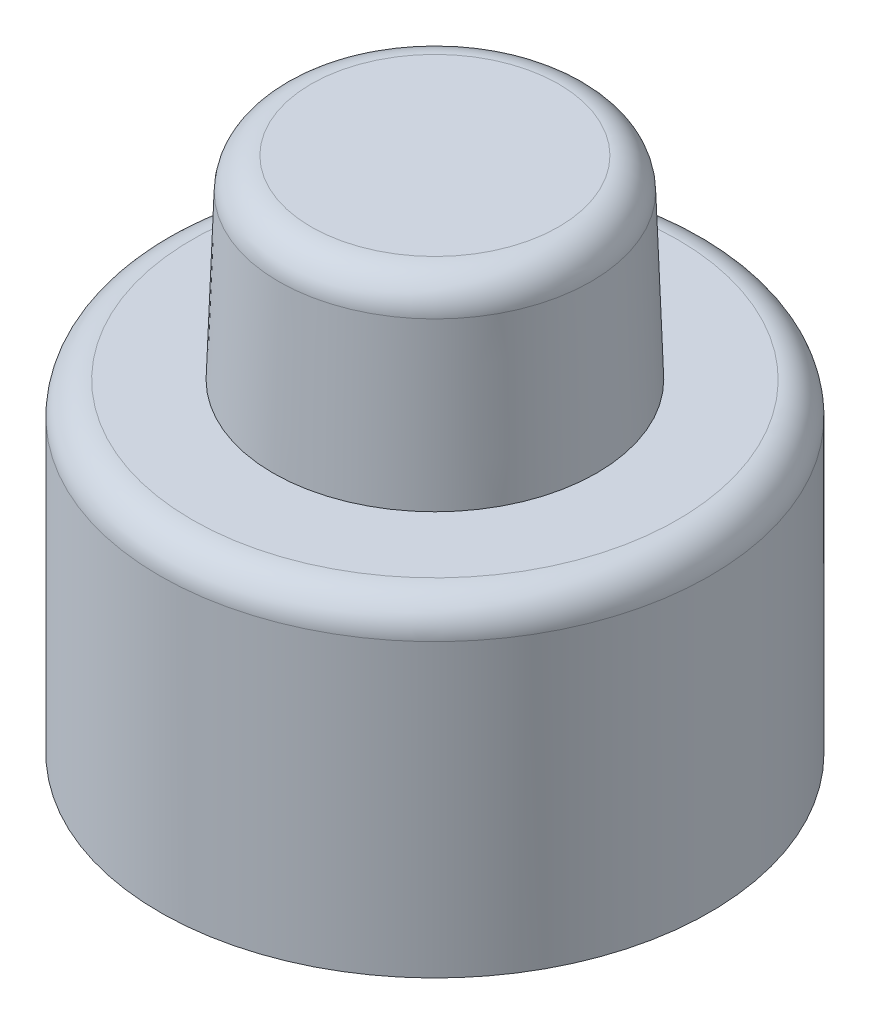
ISO-10303-21;
HEADER;
FILE_DESCRIPTION(('STEP AP214'),'2;1');
FILE_NAME('part.step','',(''),(''),'','','');
FILE_SCHEMA(('AUTOMOTIVE_DESIGN { 1 0 10303 214 1 1 1 1 }'));
ENDSEC;
DATA;
#1=APPLICATION_CONTEXT('core data for automotive mechanical design processes');
#2=APPLICATION_PROTOCOL_DEFINITION('international standard','automotive_design',2000,#1);
#3=PRODUCT_CONTEXT('',#1,'mechanical');
#4=PRODUCT('Part','Part','',(#3));
#5=PRODUCT_RELATED_PRODUCT_CATEGORY('part','',(#4));
#6=PRODUCT_DEFINITION_FORMATION('','',#4);
#7=PRODUCT_DEFINITION_CONTEXT('part definition',#1,'design');
#8=PRODUCT_DEFINITION('design','',#6,#7);
#9=PRODUCT_DEFINITION_SHAPE('','',#8);
#10=(LENGTH_UNIT() NAMED_UNIT(*) SI_UNIT(.MILLI.,.METRE.));
#11=(NAMED_UNIT(*) PLANE_ANGLE_UNIT() SI_UNIT($,.RADIAN.));
#12=(NAMED_UNIT(*) SI_UNIT($,.STERADIAN.) SOLID_ANGLE_UNIT());
#13=UNCERTAINTY_MEASURE_WITH_UNIT(LENGTH_MEASURE(1.E-05),#10,'distance_accuracy_value','');
#14=(GEOMETRIC_REPRESENTATION_CONTEXT(3) GLOBAL_UNCERTAINTY_ASSIGNED_CONTEXT((#13)) GLOBAL_UNIT_ASSIGNED_CONTEXT((#10,
#11,#12)) REPRESENTATION_CONTEXT('',''));
#15=CARTESIAN_POINT('',(0.,0.,0.));
#16=DIRECTION('',(0.,0.,1.));
#17=DIRECTION('',(1.,0.,0.));
#18=AXIS2_PLACEMENT_3D('',#15,#16,#17);
#19=CARTESIAN_POINT('',(-51.1201704164734,6.,0.));
#20=DIRECTION('',(0.,-1.,0.));
#21=DIRECTION('',(0.,0.,-1.));
#22=AXIS2_PLACEMENT_3D('',#19,#20,#21);
#23=CYLINDRICAL_SURFACE('',#22,8.5);
#24=CARTESIAN_POINT('',(-51.1201704164734,5.,0.));
#25=DIRECTION('',(0.,1.,0.));
#26=DIRECTION('',(0.,0.,1.));
#27=AXIS2_PLACEMENT_3D('',#24,#25,#26);
#28=CIRCLE('',#27,8.5);
#29=CARTESIAN_POINT('',(-51.1201704164734,5.,8.5));
#30=VERTEX_POINT('',#29);
#31=EDGE_CURVE('E138',#30,#30,#28,.F.);
#32=ORIENTED_EDGE('',*,*,#31,.T.);
#33=EDGE_LOOP('',(#32));
#34=FACE_BOUND('',#33,.T.);
#35=CARTESIAN_POINT('',(-51.1201704164734,3.,0.));
#36=DIRECTION('',(0.,-1.,0.));
#37=DIRECTION('',(0.,0.,-1.));
#38=AXIS2_PLACEMENT_3D('',#35,#36,#37);
#39=CIRCLE('',#38,8.50000000000004);
#40=CARTESIAN_POINT('',(-46.6165479283482,3.,-7.20884071709545));
#41=VERTEX_POINT('',#40);
#42=CARTESIAN_POINT('',(-51.6201704164734,3.,-8.48528137423857));
#43=VERTEX_POINT('',#42);
#44=EDGE_CURVE('E85',#41,#43,#39,.F.);
#45=ORIENTED_EDGE('',*,*,#44,.T.);
#46=DIRECTION('',(0.,1.,0.));
#47=VECTOR('',#46,1.);
#48=CARTESIAN_POINT('',(-51.6201704164734,-4.,-8.48528137423857));
#49=LINE('',#48,#47);
#50=CARTESIAN_POINT('',(-51.6201704164734,-4.,-8.48528137423857));
#51=VERTEX_POINT('',#50);
#52=EDGE_CURVE('E88',#51,#43,#49,.T.);
#53=ORIENTED_EDGE('',*,*,#52,.F.);
#54=CARTESIAN_POINT('',(-51.1201704164734,-4.,0.));
#55=DIRECTION('',(0.,-1.,0.));
#56=DIRECTION('',(0.,0.,-1.));
#57=AXIS2_PLACEMENT_3D('',#54,#55,#56);
#58=CIRCLE('',#57,8.5);
#59=CARTESIAN_POINT('',(-46.6165479283482,-4.,-7.20884071709545));
#60=VERTEX_POINT('',#59);
#61=EDGE_CURVE('E57',#60,#51,#58,.T.);
#62=ORIENTED_EDGE('',*,*,#61,.F.);
#63=DIRECTION('',(0.,1.,0.));
#64=VECTOR('',#63,1.);
#65=CARTESIAN_POINT('',(-46.6165479283482,-4.,-7.20884071709545));
#66=LINE('',#65,#64);
#67=EDGE_CURVE('E65',#60,#41,#66,.T.);
#68=ORIENTED_EDGE('',*,*,#67,.T.);
#69=EDGE_LOOP('',(#45,#53,#62,#68));
#70=FACE_BOUND('',#69,.T.);
#71=ADVANCED_FACE('F41',(#34,#70),#23,.T.);
#72=CARTESIAN_POINT('',(-51.1201704164734,6.,0.));
#73=DIRECTION('',(0.,1.,0.));
#74=DIRECTION('',(0.,0.,1.));
#75=AXIS2_PLACEMENT_3D('',#72,#73,#74);
#76=PLANE('',#75);
#77=CARTESIAN_POINT('',(-51.1201704164734,6.,0.));
#78=DIRECTION('',(0.,1.,0.));
#79=DIRECTION('',(0.,0.,1.));
#80=AXIS2_PLACEMENT_3D('',#77,#78,#79);
#81=CIRCLE('',#80,5.);
#82=CARTESIAN_POINT('',(-51.1201704164734,6.,5.));
#83=VERTEX_POINT('',#82);
#84=EDGE_CURVE('E130',#83,#83,#81,.T.);
#85=ORIENTED_EDGE('',*,*,#84,.F.);
#86=EDGE_LOOP('',(#85));
#87=FACE_BOUND('',#86,.T.);
#88=CARTESIAN_POINT('',(-51.1201704164734,6.,0.));
#89=DIRECTION('',(0.,1.,0.));
#90=DIRECTION('',(0.,0.,1.));
#91=AXIS2_PLACEMENT_3D('',#88,#89,#90);
#92=CIRCLE('',#91,7.5);
#93=CARTESIAN_POINT('',(-51.1201704164734,6.,7.5));
#94=VERTEX_POINT('',#93);
#95=EDGE_CURVE('E134',#94,#94,#92,.T.);
#96=ORIENTED_EDGE('',*,*,#95,.T.);
#97=EDGE_LOOP('',(#96));
#98=FACE_BOUND('',#97,.T.);
#99=ADVANCED_FACE('F161',(#87,#98),#76,.T.);
#100=CARTESIAN_POINT('',(-51.1201704164734,5.,0.));
#101=DIRECTION('',(0.,1.,0.));
#102=DIRECTION('',(0.,0.,1.));
#103=AXIS2_PLACEMENT_3D('',#100,#101,#102);
#104=TOROIDAL_SURFACE('',#103,7.5,1.);
#105=ORIENTED_EDGE('',*,*,#31,.F.);
#106=EDGE_LOOP('',(#105));
#107=FACE_BOUND('',#106,.T.);
#108=ORIENTED_EDGE('',*,*,#95,.F.);
#109=EDGE_LOOP('',(#108));
#110=FACE_BOUND('',#109,.T.);
#111=ADVANCED_FACE('F167',(#107,#110),#104,.T.);
#112=CARTESIAN_POINT('',(-51.1201704164734,6.,0.));
#113=DIRECTION('',(0.,-1.,0.));
#114=DIRECTION('',(0.,0.,1.));
#115=AXIS2_PLACEMENT_3D('',#112,#113,#114);
#116=CONICAL_SURFACE('',#115,5.,0.0349065850398866);
#117=CARTESIAN_POINT('',(-51.1201704164734,11.0348994967025,0.));
#118=DIRECTION('',(0.,-1.,0.));
#119=DIRECTION('',(0.,0.,-1.));
#120=AXIS2_PLACEMENT_3D('',#117,#118,#119);
#121=CIRCLE('',#120,4.82417743526153);
#122=CARTESIAN_POINT('',(-51.1201704164734,11.0348994967025,-4.82417743526153));
#123=VERTEX_POINT('',#122);
#124=EDGE_CURVE('E11',#123,#123,#121,.T.);
#125=ORIENTED_EDGE('',*,*,#124,.T.);
#126=EDGE_LOOP('',(#125));
#127=FACE_BOUND('',#126,.T.);
#128=ORIENTED_EDGE('',*,*,#84,.T.);
#129=EDGE_LOOP('',(#128));
#130=FACE_BOUND('',#129,.T.);
#131=ADVANCED_FACE('F158',(#127,#130),#116,.T.);
#132=CARTESIAN_POINT('',(-51.1201704164734,12.,0.));
#133=DIRECTION('',(0.,1.,0.));
#134=DIRECTION('',(0.,0.,1.));
#135=AXIS2_PLACEMENT_3D('',#132,#133,#134);
#136=PLANE('',#135);
#137=CARTESIAN_POINT('',(-51.1201704164734,12.,0.));
#138=DIRECTION('',(0.,1.,0.));
#139=DIRECTION('',(0.,0.,1.));
#140=AXIS2_PLACEMENT_3D('',#137,#138,#139);
#141=CIRCLE('',#140,3.82478660824244);
#142=CARTESIAN_POINT('',(-51.1201704164734,12.,3.82478660824244));
#143=VERTEX_POINT('',#142);
#144=EDGE_CURVE('E50',#143,#143,#141,.T.);
#145=ORIENTED_EDGE('',*,*,#144,.T.);
#146=EDGE_LOOP('',(#145));
#147=FACE_BOUND('',#146,.T.);
#148=ADVANCED_FACE('F145',(#147),#136,.T.);
#149=CARTESIAN_POINT('',(-51.1201704164734,11.,0.));
#150=DIRECTION('',(0.,1.,0.));
#151=DIRECTION('',(0.,0.,1.));
#152=AXIS2_PLACEMENT_3D('',#149,#150,#151);
#153=TOROIDAL_SURFACE('',#152,3.82478660824244,1.);
#154=ORIENTED_EDGE('',*,*,#124,.F.);
#155=EDGE_LOOP('',(#154));
#156=FACE_BOUND('',#155,.T.);
#157=ORIENTED_EDGE('',*,*,#144,.F.);
#158=EDGE_LOOP('',(#157));
#159=FACE_BOUND('',#158,.T.);
#160=ADVANCED_FACE('F43',(#156,#159),#153,.T.);
#161=CARTESIAN_POINT('',(-51.6201704164734,-4.,0.));
#162=DIRECTION('',(1.,0.,0.));
#163=DIRECTION('',(0.,0.,-1.));
#164=AXIS2_PLACEMENT_3D('',#161,#162,#163);
#165=PLANE('',#164);
#166=ORIENTED_EDGE('',*,*,#52,.T.);
#167=DIRECTION('',(0.,0.,1.));
#168=VECTOR('',#167,1.);
#169=CARTESIAN_POINT('',(-51.6201704164734,3.,0.));
#170=LINE('',#169,#168);
#171=CARTESIAN_POINT('',(-51.6201704164734,3.,1.51471862576143));
#172=VERTEX_POINT('',#171);
#173=EDGE_CURVE('E103',#43,#172,#170,.T.);
#174=ORIENTED_EDGE('',*,*,#173,.T.);
#175=DIRECTION('',(0.,1.,0.));
#176=VECTOR('',#175,1.);
#177=CARTESIAN_POINT('',(-51.6201704164734,-4.,1.51471862576143));
#178=LINE('',#177,#176);
#179=CARTESIAN_POINT('',(-51.6201704164734,-4.,1.51471862576143));
#180=VERTEX_POINT('',#179);
#181=EDGE_CURVE('E127',#180,#172,#178,.T.);
#182=ORIENTED_EDGE('',*,*,#181,.F.);
#183=DIRECTION('',(0.,0.,-1.));
#184=VECTOR('',#183,1.);
#185=CARTESIAN_POINT('',(-51.6201704164734,-4.,0.));
#186=LINE('',#185,#184);
#187=EDGE_CURVE('E111',#180,#51,#186,.T.);
#188=ORIENTED_EDGE('',*,*,#187,.T.);
#189=EDGE_LOOP('',(#166,#174,#182,#188));
#190=FACE_BOUND('',#189,.T.);
#191=ADVANCED_FACE('F148',(#190),#165,.T.);
#192=CARTESIAN_POINT('',(0.,-4.,1.51471862576143));
#193=DIRECTION('',(0.,0.,1.));
#194=DIRECTION('',(1.,0.,0.));
#195=AXIS2_PLACEMENT_3D('',#192,#193,#194);
#196=PLANE('',#195);
#197=ORIENTED_EDGE('',*,*,#181,.T.);
#198=DIRECTION('',(1.,0.,0.));
#199=VECTOR('',#198,1.);
#200=CARTESIAN_POINT('',(0.,3.,1.51471862576143));
#201=LINE('',#200,#199);
#202=CARTESIAN_POINT('',(-46.6165479283482,3.,1.51471862576143));
#203=VERTEX_POINT('',#202);
#204=EDGE_CURVE('E98',#172,#203,#201,.T.);
#205=ORIENTED_EDGE('',*,*,#204,.T.);
#206=DIRECTION('',(0.,1.,0.));
#207=VECTOR('',#206,1.);
#208=CARTESIAN_POINT('',(-46.6165479283482,-4.,1.51471862576143));
#209=LINE('',#208,#207);
#210=CARTESIAN_POINT('',(-46.6165479283482,-4.,1.51471862576143));
#211=VERTEX_POINT('',#210);
#212=EDGE_CURVE('E87',#211,#203,#209,.T.);
#213=ORIENTED_EDGE('',*,*,#212,.F.);
#214=DIRECTION('',(1.,0.,0.));
#215=VECTOR('',#214,1.);
#216=CARTESIAN_POINT('',(0.,-4.,1.51471862576143));
#217=LINE('',#216,#215);
#218=EDGE_CURVE('E115',#180,#211,#217,.T.);
#219=ORIENTED_EDGE('',*,*,#218,.F.);
#220=EDGE_LOOP('',(#197,#205,#213,#219));
#221=FACE_BOUND('',#220,.T.);
#222=ADVANCED_FACE('F155',(#221),#196,.F.);
#223=CARTESIAN_POINT('',(-46.6165479283482,-4.,0.));
#224=DIRECTION('',(-1.,0.,0.));
#225=DIRECTION('',(0.,0.,1.));
#226=AXIS2_PLACEMENT_3D('',#223,#224,#225);
#227=PLANE('',#226);
#228=ORIENTED_EDGE('',*,*,#212,.T.);
#229=DIRECTION('',(0.,0.,-1.));
#230=VECTOR('',#229,1.);
#231=CARTESIAN_POINT('',(-46.6165479283482,3.,0.));
#232=LINE('',#231,#230);
#233=EDGE_CURVE('E91',#203,#41,#232,.T.);
#234=ORIENTED_EDGE('',*,*,#233,.T.);
#235=ORIENTED_EDGE('',*,*,#67,.F.);
#236=DIRECTION('',(0.,0.,1.));
#237=VECTOR('',#236,1.);
#238=CARTESIAN_POINT('',(-46.6165479283482,-4.,0.));
#239=LINE('',#238,#237);
#240=EDGE_CURVE('E118',#60,#211,#239,.T.);
#241=ORIENTED_EDGE('',*,*,#240,.T.);
#242=EDGE_LOOP('',(#228,#234,#235,#241));
#243=FACE_BOUND('',#242,.T.);
#244=ADVANCED_FACE('F92',(#243),#227,.T.);
#245=CARTESIAN_POINT('',(0.,-4.,0.));
#246=DIRECTION('',(0.,-1.,0.));
#247=DIRECTION('',(0.,0.,-1.));
#248=AXIS2_PLACEMENT_3D('',#245,#246,#247);
#249=PLANE('',#248);
#250=ORIENTED_EDGE('',*,*,#187,.F.);
#251=ORIENTED_EDGE('',*,*,#218,.T.);
#252=ORIENTED_EDGE('',*,*,#240,.F.);
#253=ORIENTED_EDGE('',*,*,#61,.T.);
#254=EDGE_LOOP('',(#250,#251,#252,#253));
#255=FACE_BOUND('',#254,.T.);
#256=ADVANCED_FACE('F190',(#255),#249,.T.);
#257=CARTESIAN_POINT('',(0.,3.,0.));
#258=DIRECTION('',(0.,-1.,0.));
#259=DIRECTION('',(0.,0.,-1.));
#260=AXIS2_PLACEMENT_3D('',#257,#258,#259);
#261=PLANE('',#260);
#262=ORIENTED_EDGE('',*,*,#44,.F.);
#263=ORIENTED_EDGE('',*,*,#233,.F.);
#264=ORIENTED_EDGE('',*,*,#204,.F.);
#265=ORIENTED_EDGE('',*,*,#173,.F.);
#266=EDGE_LOOP('',(#262,#263,#264,#265));
#267=FACE_BOUND('',#266,.T.);
#268=ADVANCED_FACE('F101',(#267),#261,.T.);
#269=CLOSED_SHELL('',(#71,#99,#111,#131,#148,#160,#191,#222,#244,#256,#268));
#270=MANIFOLD_SOLID_BREP('B2',#269);
#271=ADVANCED_BREP_SHAPE_REPRESENTATION('',(#18,#270),#14);
#272=SHAPE_DEFINITION_REPRESENTATION(#9,#271);
ENDSEC;
END-ISO-10303-21;
